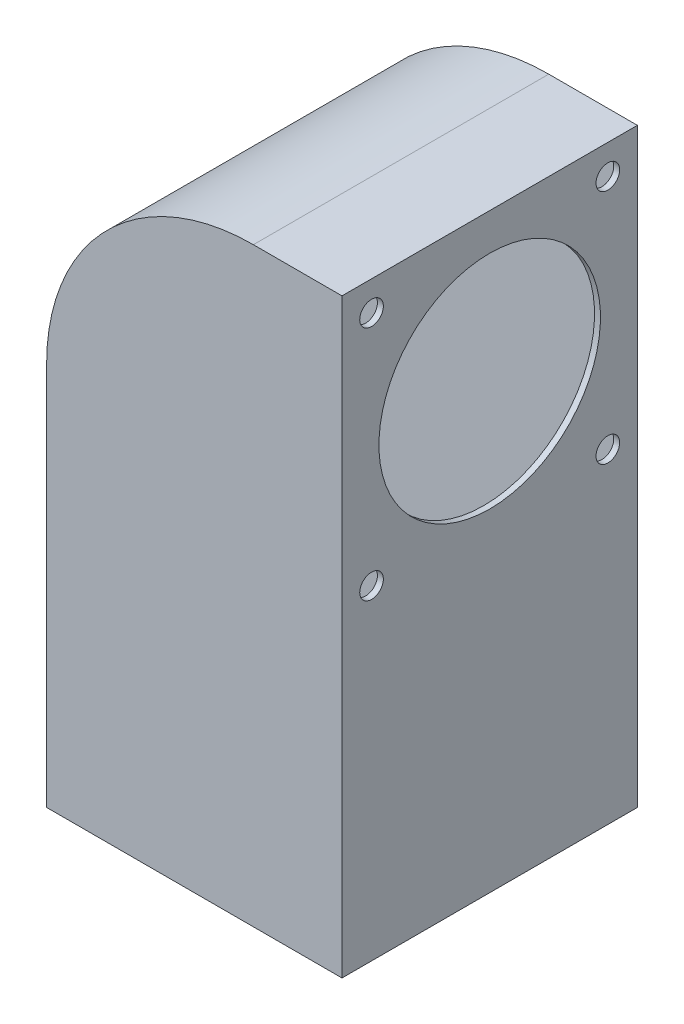
ISO-10303-21;
HEADER;
FILE_DESCRIPTION(('STEP AP214'),'2;1');
FILE_NAME('part.step','',(''),(''),'','','');
FILE_SCHEMA(('AUTOMOTIVE_DESIGN { 1 0 10303 214 1 1 1 1 }'));
ENDSEC;
DATA;
#1=APPLICATION_CONTEXT('core data for automotive mechanical design processes');
#2=APPLICATION_PROTOCOL_DEFINITION('international standard','automotive_design',2000,#1);
#3=PRODUCT_CONTEXT('',#1,'mechanical');
#4=PRODUCT('Part','Part','',(#3));
#5=PRODUCT_RELATED_PRODUCT_CATEGORY('part','',(#4));
#6=PRODUCT_DEFINITION_FORMATION('','',#4);
#7=PRODUCT_DEFINITION_CONTEXT('part definition',#1,'design');
#8=PRODUCT_DEFINITION('design','',#6,#7);
#9=PRODUCT_DEFINITION_SHAPE('','',#8);
#10=(LENGTH_UNIT() NAMED_UNIT(*) SI_UNIT(.MILLI.,.METRE.));
#11=(NAMED_UNIT(*) PLANE_ANGLE_UNIT() SI_UNIT($,.RADIAN.));
#12=(NAMED_UNIT(*) SI_UNIT($,.STERADIAN.) SOLID_ANGLE_UNIT());
#13=UNCERTAINTY_MEASURE_WITH_UNIT(LENGTH_MEASURE(1.E-05),#10,'distance_accuracy_value','');
#14=(GEOMETRIC_REPRESENTATION_CONTEXT(3) GLOBAL_UNCERTAINTY_ASSIGNED_CONTEXT((#13)) GLOBAL_UNIT_ASSIGNED_CONTEXT((#10,
#11,#12)) REPRESENTATION_CONTEXT('',''));
#15=CARTESIAN_POINT('',(0.,0.,0.));
#16=DIRECTION('',(0.,0.,1.));
#17=DIRECTION('',(1.,0.,0.));
#18=AXIS2_PLACEMENT_3D('',#15,#16,#17);
#19=CARTESIAN_POINT('',(0.,-200.,0.));
#20=DIRECTION('',(0.,-1.,0.));
#21=DIRECTION('',(-1.,0.,0.));
#22=AXIS2_PLACEMENT_3D('',#19,#20,#21);
#23=PLANE('',#22);
#24=DIRECTION('',(-1.,0.,0.));
#25=VECTOR('',#24,1.);
#26=CARTESIAN_POINT('',(0.,-200.,0.));
#27=LINE('',#26,#25);
#28=CARTESIAN_POINT('',(0.,-200.,0.));
#29=VERTEX_POINT('',#28);
#30=CARTESIAN_POINT('',(-100.,-200.,0.));
#31=VERTEX_POINT('',#30);
#32=EDGE_CURVE('E53',#29,#31,#27,.T.);
#33=ORIENTED_EDGE('',*,*,#32,.F.);
#34=DIRECTION('',(0.,0.,1.));
#35=VECTOR('',#34,1.);
#36=CARTESIAN_POINT('',(0.,-200.,0.));
#37=LINE('',#36,#35);
#38=CARTESIAN_POINT('',(0.,-200.,100.));
#39=VERTEX_POINT('',#38);
#40=EDGE_CURVE('E44',#29,#39,#37,.T.);
#41=ORIENTED_EDGE('',*,*,#40,.T.);
#42=DIRECTION('',(-1.,0.,0.));
#43=VECTOR('',#42,1.);
#44=CARTESIAN_POINT('',(-100.,-200.,100.));
#45=LINE('',#44,#43);
#46=CARTESIAN_POINT('',(-100.,-200.,100.));
#47=VERTEX_POINT('',#46);
#48=EDGE_CURVE('E195',#39,#47,#45,.T.);
#49=ORIENTED_EDGE('',*,*,#48,.T.);
#50=DIRECTION('',(0.,0.,1.));
#51=VECTOR('',#50,1.);
#52=CARTESIAN_POINT('',(-100.,-200.,0.));
#53=LINE('',#52,#51);
#54=EDGE_CURVE('E175',#31,#47,#53,.T.);
#55=ORIENTED_EDGE('',*,*,#54,.F.);
#56=EDGE_LOOP('',(#33,#41,#49,#55));
#57=FACE_BOUND('',#56,.T.);
#58=DIRECTION('',(-1.,0.,0.));
#59=VECTOR('',#58,1.);
#60=CARTESIAN_POINT('',(-30.,-200.,2.));
#61=LINE('',#60,#59);
#62=CARTESIAN_POINT('',(-1.99999999999997,-200.,2.));
#63=VERTEX_POINT('',#62);
#64=CARTESIAN_POINT('',(-98.,-200.,2.));
#65=VERTEX_POINT('',#64);
#66=EDGE_CURVE('E108',#63,#65,#61,.T.);
#67=ORIENTED_EDGE('',*,*,#66,.T.);
#68=DIRECTION('',(0.,0.,1.));
#69=VECTOR('',#68,1.);
#70=CARTESIAN_POINT('',(-98.,-200.,0.));
#71=LINE('',#70,#69);
#72=CARTESIAN_POINT('',(-97.9999999999999,-200.,98.));
#73=VERTEX_POINT('',#72);
#74=EDGE_CURVE('E115',#65,#73,#71,.T.);
#75=ORIENTED_EDGE('',*,*,#74,.T.);
#76=DIRECTION('',(-1.,0.,0.));
#77=VECTOR('',#76,1.);
#78=CARTESIAN_POINT('',(-30.,-200.,98.));
#79=LINE('',#78,#77);
#80=CARTESIAN_POINT('',(-1.99999999999998,-200.,98.));
#81=VERTEX_POINT('',#80);
#82=EDGE_CURVE('E128',#81,#73,#79,.T.);
#83=ORIENTED_EDGE('',*,*,#82,.F.);
#84=DIRECTION('',(0.,0.,1.));
#85=VECTOR('',#84,1.);
#86=CARTESIAN_POINT('',(-1.99999999999998,-200.,0.));
#87=LINE('',#86,#85);
#88=EDGE_CURVE('E127',#63,#81,#87,.T.);
#89=ORIENTED_EDGE('',*,*,#88,.F.);
#90=EDGE_LOOP('',(#67,#75,#83,#89));
#91=FACE_BOUND('',#90,.T.);
#92=ADVANCED_FACE('F35',(#57,#91),#23,.T.);
#93=CARTESIAN_POINT('',(0.,0.,0.));
#94=DIRECTION('',(1.,0.,0.));
#95=DIRECTION('',(0.,1.,0.));
#96=AXIS2_PLACEMENT_3D('',#93,#94,#95);
#97=PLANE('',#96);
#98=CARTESIAN_POINT('',(0.,-90.,90.));
#99=DIRECTION('',(1.,0.,0.));
#100=DIRECTION('',(0.,-1.,0.));
#101=AXIS2_PLACEMENT_3D('',#98,#99,#100);
#102=CIRCLE('',#101,4.00000000000003);
#103=CARTESIAN_POINT('',(0.,-94.0000000000001,90.));
#104=VERTEX_POINT('',#103);
#105=EDGE_CURVE('E156',#104,#104,#102,.T.);
#106=ORIENTED_EDGE('',*,*,#105,.F.);
#107=EDGE_LOOP('',(#106));
#108=FACE_BOUND('',#107,.T.);
#109=CARTESIAN_POINT('',(0.,-90.,9.99999999999999));
#110=DIRECTION('',(1.,0.,0.));
#111=DIRECTION('',(0.,1.,0.));
#112=AXIS2_PLACEMENT_3D('',#109,#110,#111);
#113=CIRCLE('',#112,3.99999999999995);
#114=CARTESIAN_POINT('',(0.,-86.0000000000001,9.99999999999999));
#115=VERTEX_POINT('',#114);
#116=EDGE_CURVE('E146',#115,#115,#113,.T.);
#117=ORIENTED_EDGE('',*,*,#116,.F.);
#118=EDGE_LOOP('',(#117));
#119=FACE_BOUND('',#118,.T.);
#120=CARTESIAN_POINT('',(0.,-10.,9.99999999999999));
#121=DIRECTION('',(1.,0.,0.));
#122=DIRECTION('',(0.,-1.,0.));
#123=AXIS2_PLACEMENT_3D('',#120,#121,#122);
#124=CIRCLE('',#123,3.99999999999998);
#125=CARTESIAN_POINT('',(0.,-14.,9.99999999999999));
#126=VERTEX_POINT('',#125);
#127=EDGE_CURVE('E143',#126,#126,#124,.T.);
#128=ORIENTED_EDGE('',*,*,#127,.F.);
#129=EDGE_LOOP('',(#128));
#130=FACE_BOUND('',#129,.T.);
#131=CARTESIAN_POINT('',(0.,-10.,90.));
#132=DIRECTION('',(1.,0.,0.));
#133=DIRECTION('',(0.,1.,0.));
#134=AXIS2_PLACEMENT_3D('',#131,#132,#133);
#135=CIRCLE('',#134,4.00000000000001);
#136=CARTESIAN_POINT('',(0.,-6.00000000000002,90.));
#137=VERTEX_POINT('',#136);
#138=EDGE_CURVE('E140',#137,#137,#135,.T.);
#139=ORIENTED_EDGE('',*,*,#138,.F.);
#140=EDGE_LOOP('',(#139));
#141=FACE_BOUND('',#140,.T.);
#142=CARTESIAN_POINT('',(0.,-50.,50.));
#143=DIRECTION('',(1.,0.,0.));
#144=DIRECTION('',(0.,1.,0.));
#145=AXIS2_PLACEMENT_3D('',#142,#143,#144);
#146=CIRCLE('',#145,37.5);
#147=CARTESIAN_POINT('',(0.,-12.5,50.));
#148=VERTEX_POINT('',#147);
#149=EDGE_CURVE('E136',#148,#148,#146,.T.);
#150=ORIENTED_EDGE('',*,*,#149,.F.);
#151=EDGE_LOOP('',(#150));
#152=FACE_BOUND('',#151,.T.);
#153=DIRECTION('',(0.,1.,0.));
#154=VECTOR('',#153,1.);
#155=CARTESIAN_POINT('',(0.,0.,100.));
#156=LINE('',#155,#154);
#157=CARTESIAN_POINT('',(0.,0.,100.));
#158=VERTEX_POINT('',#157);
#159=EDGE_CURVE('E166',#39,#158,#156,.T.);
#160=ORIENTED_EDGE('',*,*,#159,.F.);
#161=ORIENTED_EDGE('',*,*,#40,.F.);
#162=DIRECTION('',(0.,1.,0.));
#163=VECTOR('',#162,1.);
#164=CARTESIAN_POINT('',(0.,0.,0.));
#165=LINE('',#164,#163);
#166=CARTESIAN_POINT('',(0.,0.,0.));
#167=VERTEX_POINT('',#166);
#168=EDGE_CURVE('E11',#29,#167,#165,.T.);
#169=ORIENTED_EDGE('',*,*,#168,.T.);
#170=DIRECTION('',(0.,0.,1.));
#171=VECTOR('',#170,1.);
#172=CARTESIAN_POINT('',(0.,0.,0.));
#173=LINE('',#172,#171);
#174=EDGE_CURVE('E167',#167,#158,#173,.T.);
#175=ORIENTED_EDGE('',*,*,#174,.T.);
#176=EDGE_LOOP('',(#160,#161,#169,#175));
#177=FACE_BOUND('',#176,.T.);
#178=ADVANCED_FACE('F239',(#108,#119,#130,#141,#152,#177),#97,.T.);
#179=CARTESIAN_POINT('',(0.,0.,0.));
#180=DIRECTION('',(0.,1.,0.));
#181=DIRECTION('',(-1.,0.,0.));
#182=AXIS2_PLACEMENT_3D('',#179,#180,#181);
#183=PLANE('',#182);
#184=DIRECTION('',(-1.,0.,0.));
#185=VECTOR('',#184,1.);
#186=CARTESIAN_POINT('',(0.,0.,100.));
#187=LINE('',#186,#185);
#188=CARTESIAN_POINT('',(-30.,0.,100.));
#189=VERTEX_POINT('',#188);
#190=EDGE_CURVE('E171',#158,#189,#187,.T.);
#191=ORIENTED_EDGE('',*,*,#190,.F.);
#192=ORIENTED_EDGE('',*,*,#174,.F.);
#193=DIRECTION('',(-1.,0.,0.));
#194=VECTOR('',#193,1.);
#195=CARTESIAN_POINT('',(0.,0.,0.));
#196=LINE('',#195,#194);
#197=CARTESIAN_POINT('',(-30.,0.,0.));
#198=VERTEX_POINT('',#197);
#199=EDGE_CURVE('E163',#167,#198,#196,.T.);
#200=ORIENTED_EDGE('',*,*,#199,.T.);
#201=DIRECTION('',(0.,0.,1.));
#202=VECTOR('',#201,1.);
#203=CARTESIAN_POINT('',(-30.,0.,0.));
#204=LINE('',#203,#202);
#205=EDGE_CURVE('E172',#198,#189,#204,.T.);
#206=ORIENTED_EDGE('',*,*,#205,.T.);
#207=EDGE_LOOP('',(#191,#192,#200,#206));
#208=FACE_BOUND('',#207,.T.);
#209=ADVANCED_FACE('F241',(#208),#183,.T.);
#210=CARTESIAN_POINT('',(-30.,-70.,0.));
#211=DIRECTION('',(0.,0.,1.));
#212=DIRECTION('',(1.,0.,0.));
#213=AXIS2_PLACEMENT_3D('',#210,#211,#212);
#214=CYLINDRICAL_SURFACE('',#213,70.);
#215=CARTESIAN_POINT('',(-30.,-70.,100.));
#216=DIRECTION('',(0.,0.,1.));
#217=DIRECTION('',(1.,0.,0.));
#218=AXIS2_PLACEMENT_3D('',#215,#216,#217);
#219=CIRCLE('',#218,70.);
#220=CARTESIAN_POINT('',(-100.,-70.,100.));
#221=VERTEX_POINT('',#220);
#222=EDGE_CURVE('E179',#189,#221,#219,.T.);
#223=ORIENTED_EDGE('',*,*,#222,.F.);
#224=ORIENTED_EDGE('',*,*,#205,.F.);
#225=CARTESIAN_POINT('',(-30.,-70.,0.));
#226=DIRECTION('',(0.,0.,1.));
#227=DIRECTION('',(1.,0.,0.));
#228=AXIS2_PLACEMENT_3D('',#225,#226,#227);
#229=CIRCLE('',#228,70.);
#230=CARTESIAN_POINT('',(-100.,-70.,0.));
#231=VERTEX_POINT('',#230);
#232=EDGE_CURVE('E168',#198,#231,#229,.T.);
#233=ORIENTED_EDGE('',*,*,#232,.T.);
#234=DIRECTION('',(0.,0.,1.));
#235=VECTOR('',#234,1.);
#236=CARTESIAN_POINT('',(-100.,-70.,0.));
#237=LINE('',#236,#235);
#238=EDGE_CURVE('E176',#231,#221,#237,.T.);
#239=ORIENTED_EDGE('',*,*,#238,.T.);
#240=EDGE_LOOP('',(#223,#224,#233,#239));
#241=FACE_BOUND('',#240,.T.);
#242=ADVANCED_FACE('F248',(#241),#214,.T.);
#243=CARTESIAN_POINT('',(-100.,-70.,0.));
#244=DIRECTION('',(-1.,0.,0.));
#245=DIRECTION('',(0.,-1.,0.));
#246=AXIS2_PLACEMENT_3D('',#243,#244,#245);
#247=PLANE('',#246);
#248=DIRECTION('',(0.,-1.,0.));
#249=VECTOR('',#248,1.);
#250=CARTESIAN_POINT('',(-100.,-70.,100.));
#251=LINE('',#250,#249);
#252=EDGE_CURVE('E181',#221,#47,#251,.T.);
#253=ORIENTED_EDGE('',*,*,#252,.F.);
#254=ORIENTED_EDGE('',*,*,#238,.F.);
#255=DIRECTION('',(0.,-1.,0.));
#256=VECTOR('',#255,1.);
#257=CARTESIAN_POINT('',(-100.,-70.,0.));
#258=LINE('',#257,#256);
#259=EDGE_CURVE('E173',#231,#31,#258,.T.);
#260=ORIENTED_EDGE('',*,*,#259,.T.);
#261=ORIENTED_EDGE('',*,*,#54,.T.);
#262=EDGE_LOOP('',(#253,#254,#260,#261));
#263=FACE_BOUND('',#262,.T.);
#264=ADVANCED_FACE('F260',(#263),#247,.T.);
#265=CARTESIAN_POINT('',(-30.,-70.,0.));
#266=DIRECTION('',(0.,0.,-1.));
#267=DIRECTION('',(-1.,0.,0.));
#268=AXIS2_PLACEMENT_3D('',#265,#266,#267);
#269=PLANE('',#268);
#270=ORIENTED_EDGE('',*,*,#168,.F.);
#271=ORIENTED_EDGE('',*,*,#32,.T.);
#272=ORIENTED_EDGE('',*,*,#259,.F.);
#273=ORIENTED_EDGE('',*,*,#232,.F.);
#274=ORIENTED_EDGE('',*,*,#199,.F.);
#275=EDGE_LOOP('',(#270,#271,#272,#273,#274));
#276=FACE_BOUND('',#275,.T.);
#277=ADVANCED_FACE('F257',(#276),#269,.T.);
#278=CARTESIAN_POINT('',(-30.,-70.,100.));
#279=DIRECTION('',(0.,0.,-1.));
#280=DIRECTION('',(-1.,0.,0.));
#281=AXIS2_PLACEMENT_3D('',#278,#279,#280);
#282=PLANE('',#281);
#283=ORIENTED_EDGE('',*,*,#252,.T.);
#284=ORIENTED_EDGE('',*,*,#48,.F.);
#285=ORIENTED_EDGE('',*,*,#159,.T.);
#286=ORIENTED_EDGE('',*,*,#190,.T.);
#287=ORIENTED_EDGE('',*,*,#222,.T.);
#288=EDGE_LOOP('',(#283,#284,#285,#286,#287));
#289=FACE_BOUND('',#288,.T.);
#290=ADVANCED_FACE('F252',(#289),#282,.F.);
#291=CARTESIAN_POINT('',(-2.,0.,0.));
#292=DIRECTION('',(1.,0.,0.));
#293=DIRECTION('',(0.,1.,0.));
#294=AXIS2_PLACEMENT_3D('',#291,#292,#293);
#295=PLANE('',#294);
#296=CARTESIAN_POINT('',(-1.99999999999999,-90.,90.));
#297=DIRECTION('',(1.,0.,0.));
#298=DIRECTION('',(0.,1.,0.));
#299=AXIS2_PLACEMENT_3D('',#296,#297,#298);
#300=CIRCLE('',#299,4.00000000000003);
#301=CARTESIAN_POINT('',(-1.99999999999999,-86.,90.));
#302=VERTEX_POINT('',#301);
#303=EDGE_CURVE('E38',#302,#302,#300,.T.);
#304=ORIENTED_EDGE('',*,*,#303,.T.);
#305=EDGE_LOOP('',(#304));
#306=FACE_BOUND('',#305,.T.);
#307=CARTESIAN_POINT('',(-1.99999999999999,-90.,9.99999999999999));
#308=DIRECTION('',(1.,0.,0.));
#309=DIRECTION('',(0.,1.,0.));
#310=AXIS2_PLACEMENT_3D('',#307,#308,#309);
#311=CIRCLE('',#310,3.99999999999995);
#312=CARTESIAN_POINT('',(-1.99999999999999,-86.0000000000001,9.99999999999999));
#313=VERTEX_POINT('',#312);
#314=EDGE_CURVE('E144',#313,#313,#311,.T.);
#315=ORIENTED_EDGE('',*,*,#314,.T.);
#316=EDGE_LOOP('',(#315));
#317=FACE_BOUND('',#316,.T.);
#318=CARTESIAN_POINT('',(-2.,-10.,9.99999999999999));
#319=DIRECTION('',(1.,0.,0.));
#320=DIRECTION('',(0.,1.,0.));
#321=AXIS2_PLACEMENT_3D('',#318,#319,#320);
#322=CIRCLE('',#321,3.99999999999998);
#323=CARTESIAN_POINT('',(-2.,-6.00000000000004,9.99999999999999));
#324=VERTEX_POINT('',#323);
#325=EDGE_CURVE('E141',#324,#324,#322,.T.);
#326=ORIENTED_EDGE('',*,*,#325,.T.);
#327=EDGE_LOOP('',(#326));
#328=FACE_BOUND('',#327,.T.);
#329=CARTESIAN_POINT('',(-2.,-10.,90.));
#330=DIRECTION('',(1.,0.,0.));
#331=DIRECTION('',(0.,1.,0.));
#332=AXIS2_PLACEMENT_3D('',#329,#330,#331);
#333=CIRCLE('',#332,4.00000000000001);
#334=CARTESIAN_POINT('',(-2.,-6.00000000000002,90.));
#335=VERTEX_POINT('',#334);
#336=EDGE_CURVE('E137',#335,#335,#333,.T.);
#337=ORIENTED_EDGE('',*,*,#336,.T.);
#338=EDGE_LOOP('',(#337));
#339=FACE_BOUND('',#338,.T.);
#340=CARTESIAN_POINT('',(-1.99999999999999,-50.,50.));
#341=DIRECTION('',(1.,0.,0.));
#342=DIRECTION('',(0.,1.,0.));
#343=AXIS2_PLACEMENT_3D('',#340,#341,#342);
#344=CIRCLE('',#343,37.5);
#345=CARTESIAN_POINT('',(-2.,-12.5,50.));
#346=VERTEX_POINT('',#345);
#347=EDGE_CURVE('E131',#346,#346,#344,.T.);
#348=ORIENTED_EDGE('',*,*,#347,.T.);
#349=EDGE_LOOP('',(#348));
#350=FACE_BOUND('',#349,.T.);
#351=DIRECTION('',(0.,1.,0.));
#352=VECTOR('',#351,1.);
#353=CARTESIAN_POINT('',(-2.,0.,98.));
#354=LINE('',#353,#352);
#355=CARTESIAN_POINT('',(-2.,-2.,98.));
#356=VERTEX_POINT('',#355);
#357=EDGE_CURVE('E199',#81,#356,#354,.T.);
#358=ORIENTED_EDGE('',*,*,#357,.T.);
#359=DIRECTION('',(0.,0.,1.));
#360=VECTOR('',#359,1.);
#361=CARTESIAN_POINT('',(-2.,-2.,0.));
#362=LINE('',#361,#360);
#363=CARTESIAN_POINT('',(-2.,-2.,2.));
#364=VERTEX_POINT('',#363);
#365=EDGE_CURVE('E204',#364,#356,#362,.T.);
#366=ORIENTED_EDGE('',*,*,#365,.F.);
#367=DIRECTION('',(0.,1.,0.));
#368=VECTOR('',#367,1.);
#369=CARTESIAN_POINT('',(-2.,0.,2.));
#370=LINE('',#369,#368);
#371=EDGE_CURVE('E198',#63,#364,#370,.T.);
#372=ORIENTED_EDGE('',*,*,#371,.F.);
#373=ORIENTED_EDGE('',*,*,#88,.T.);
#374=EDGE_LOOP('',(#358,#366,#372,#373));
#375=FACE_BOUND('',#374,.T.);
#376=ADVANCED_FACE('F220',(#306,#317,#328,#339,#350,#375),#295,.F.);
#377=CARTESIAN_POINT('',(0.,-2.,0.));
#378=DIRECTION('',(0.,1.,0.));
#379=DIRECTION('',(-1.,0.,0.));
#380=AXIS2_PLACEMENT_3D('',#377,#378,#379);
#381=PLANE('',#380);
#382=DIRECTION('',(-1.,0.,0.));
#383=VECTOR('',#382,1.);
#384=CARTESIAN_POINT('',(0.,-2.,98.));
#385=LINE('',#384,#383);
#386=CARTESIAN_POINT('',(-30.,-2.,98.));
#387=VERTEX_POINT('',#386);
#388=EDGE_CURVE('E207',#356,#387,#385,.T.);
#389=ORIENTED_EDGE('',*,*,#388,.T.);
#390=DIRECTION('',(0.,0.,1.));
#391=VECTOR('',#390,1.);
#392=CARTESIAN_POINT('',(-30.,-2.,0.));
#393=LINE('',#392,#391);
#394=CARTESIAN_POINT('',(-30.,-2.,2.));
#395=VERTEX_POINT('',#394);
#396=EDGE_CURVE('E211',#395,#387,#393,.T.);
#397=ORIENTED_EDGE('',*,*,#396,.F.);
#398=DIRECTION('',(-1.,0.,0.));
#399=VECTOR('',#398,1.);
#400=CARTESIAN_POINT('',(0.,-2.,2.));
#401=LINE('',#400,#399);
#402=EDGE_CURVE('E202',#364,#395,#401,.T.);
#403=ORIENTED_EDGE('',*,*,#402,.F.);
#404=ORIENTED_EDGE('',*,*,#365,.T.);
#405=EDGE_LOOP('',(#389,#397,#403,#404));
#406=FACE_BOUND('',#405,.T.);
#407=ADVANCED_FACE('F224',(#406),#381,.F.);
#408=CARTESIAN_POINT('',(-30.,-70.,0.));
#409=DIRECTION('',(0.,0.,1.));
#410=DIRECTION('',(1.,0.,0.));
#411=AXIS2_PLACEMENT_3D('',#408,#409,#410);
#412=CYLINDRICAL_SURFACE('',#411,68.);
#413=CARTESIAN_POINT('',(-30.,-70.,98.));
#414=DIRECTION('',(0.,0.,-1.));
#415=DIRECTION('',(-1.,0.,0.));
#416=AXIS2_PLACEMENT_3D('',#413,#414,#415);
#417=CIRCLE('',#416,68.);
#418=CARTESIAN_POINT('',(-98.,-70.,98.));
#419=VERTEX_POINT('',#418);
#420=EDGE_CURVE('E124',#387,#419,#417,.F.);
#421=ORIENTED_EDGE('',*,*,#420,.T.);
#422=DIRECTION('',(0.,0.,1.));
#423=VECTOR('',#422,1.);
#424=CARTESIAN_POINT('',(-98.,-70.,0.));
#425=LINE('',#424,#423);
#426=CARTESIAN_POINT('',(-98.,-70.,2.));
#427=VERTEX_POINT('',#426);
#428=EDGE_CURVE('E116',#427,#419,#425,.T.);
#429=ORIENTED_EDGE('',*,*,#428,.F.);
#430=CARTESIAN_POINT('',(-30.,-70.,2.));
#431=DIRECTION('',(0.,0.,-1.));
#432=DIRECTION('',(-1.,0.,0.));
#433=AXIS2_PLACEMENT_3D('',#430,#431,#432);
#434=CIRCLE('',#433,68.);
#435=EDGE_CURVE('E111',#395,#427,#434,.F.);
#436=ORIENTED_EDGE('',*,*,#435,.F.);
#437=ORIENTED_EDGE('',*,*,#396,.T.);
#438=EDGE_LOOP('',(#421,#429,#436,#437));
#439=FACE_BOUND('',#438,.T.);
#440=ADVANCED_FACE('F226',(#439),#412,.F.);
#441=CARTESIAN_POINT('',(-98.,-70.,0.));
#442=DIRECTION('',(-1.,0.,0.));
#443=DIRECTION('',(0.,-1.,0.));
#444=AXIS2_PLACEMENT_3D('',#441,#442,#443);
#445=PLANE('',#444);
#446=DIRECTION('',(0.,-1.,0.));
#447=VECTOR('',#446,1.);
#448=CARTESIAN_POINT('',(-98.,-70.,98.));
#449=LINE('',#448,#447);
#450=EDGE_CURVE('E120',#419,#73,#449,.T.);
#451=ORIENTED_EDGE('',*,*,#450,.T.);
#452=ORIENTED_EDGE('',*,*,#74,.F.);
#453=DIRECTION('',(0.,-1.,0.));
#454=VECTOR('',#453,1.);
#455=CARTESIAN_POINT('',(-98.,-70.,2.));
#456=LINE('',#455,#454);
#457=EDGE_CURVE('E103',#427,#65,#456,.T.);
#458=ORIENTED_EDGE('',*,*,#457,.F.);
#459=ORIENTED_EDGE('',*,*,#428,.T.);
#460=EDGE_LOOP('',(#451,#452,#458,#459));
#461=FACE_BOUND('',#460,.T.);
#462=ADVANCED_FACE('F119',(#461),#445,.F.);
#463=CARTESIAN_POINT('',(-30.,-70.,2.));
#464=DIRECTION('',(0.,0.,-1.));
#465=DIRECTION('',(-1.,0.,0.));
#466=AXIS2_PLACEMENT_3D('',#463,#464,#465);
#467=PLANE('',#466);
#468=ORIENTED_EDGE('',*,*,#371,.T.);
#469=ORIENTED_EDGE('',*,*,#402,.T.);
#470=ORIENTED_EDGE('',*,*,#435,.T.);
#471=ORIENTED_EDGE('',*,*,#457,.T.);
#472=ORIENTED_EDGE('',*,*,#66,.F.);
#473=EDGE_LOOP('',(#468,#469,#470,#471,#472));
#474=FACE_BOUND('',#473,.T.);
#475=ADVANCED_FACE('F106',(#474),#467,.F.);
#476=CARTESIAN_POINT('',(-30.,-70.,98.));
#477=DIRECTION('',(0.,0.,-1.));
#478=DIRECTION('',(-1.,0.,0.));
#479=AXIS2_PLACEMENT_3D('',#476,#477,#478);
#480=PLANE('',#479);
#481=ORIENTED_EDGE('',*,*,#450,.F.);
#482=ORIENTED_EDGE('',*,*,#420,.F.);
#483=ORIENTED_EDGE('',*,*,#388,.F.);
#484=ORIENTED_EDGE('',*,*,#357,.F.);
#485=ORIENTED_EDGE('',*,*,#82,.T.);
#486=EDGE_LOOP('',(#481,#482,#483,#484,#485));
#487=FACE_BOUND('',#486,.T.);
#488=ADVANCED_FACE('F228',(#487),#480,.T.);
#489=CARTESIAN_POINT('',(-11.,-50.,50.));
#490=DIRECTION('',(1.,0.,0.));
#491=DIRECTION('',(0.,1.,0.));
#492=AXIS2_PLACEMENT_3D('',#489,#490,#491);
#493=CYLINDRICAL_SURFACE('',#492,37.5);
#494=ORIENTED_EDGE('',*,*,#149,.T.);
#495=EDGE_LOOP('',(#494));
#496=FACE_BOUND('',#495,.T.);
#497=ORIENTED_EDGE('',*,*,#347,.F.);
#498=EDGE_LOOP('',(#497));
#499=FACE_BOUND('',#498,.T.);
#500=ADVANCED_FACE('F230',(#496,#499),#493,.F.);
#501=CARTESIAN_POINT('',(-11.,-10.,90.));
#502=DIRECTION('',(1.,0.,0.));
#503=DIRECTION('',(0.,1.,0.));
#504=AXIS2_PLACEMENT_3D('',#501,#502,#503);
#505=CYLINDRICAL_SURFACE('',#504,4.00000000000001);
#506=ORIENTED_EDGE('',*,*,#138,.T.);
#507=EDGE_LOOP('',(#506));
#508=FACE_BOUND('',#507,.T.);
#509=ORIENTED_EDGE('',*,*,#336,.F.);
#510=EDGE_LOOP('',(#509));
#511=FACE_BOUND('',#510,.T.);
#512=ADVANCED_FACE('F235',(#508,#511),#505,.F.);
#513=CARTESIAN_POINT('',(-11.,-10.,9.99999999999999));
#514=DIRECTION('',(1.,0.,0.));
#515=DIRECTION('',(0.,1.,0.));
#516=AXIS2_PLACEMENT_3D('',#513,#514,#515);
#517=CYLINDRICAL_SURFACE('',#516,3.99999999999998);
#518=ORIENTED_EDGE('',*,*,#127,.T.);
#519=EDGE_LOOP('',(#518));
#520=FACE_BOUND('',#519,.T.);
#521=ORIENTED_EDGE('',*,*,#325,.F.);
#522=EDGE_LOOP('',(#521));
#523=FACE_BOUND('',#522,.T.);
#524=ADVANCED_FACE('F317',(#520,#523),#517,.F.);
#525=CARTESIAN_POINT('',(-11.,-90.,9.99999999999999));
#526=DIRECTION('',(1.,0.,0.));
#527=DIRECTION('',(0.,1.,0.));
#528=AXIS2_PLACEMENT_3D('',#525,#526,#527);
#529=CYLINDRICAL_SURFACE('',#528,3.99999999999995);
#530=ORIENTED_EDGE('',*,*,#116,.T.);
#531=EDGE_LOOP('',(#530));
#532=FACE_BOUND('',#531,.T.);
#533=ORIENTED_EDGE('',*,*,#314,.F.);
#534=EDGE_LOOP('',(#533));
#535=FACE_BOUND('',#534,.T.);
#536=ADVANCED_FACE('F327',(#532,#535),#529,.F.);
#537=CARTESIAN_POINT('',(-11.,-90.,90.));
#538=DIRECTION('',(1.,0.,0.));
#539=DIRECTION('',(0.,1.,0.));
#540=AXIS2_PLACEMENT_3D('',#537,#538,#539);
#541=CYLINDRICAL_SURFACE('',#540,4.00000000000003);
#542=ORIENTED_EDGE('',*,*,#105,.T.);
#543=EDGE_LOOP('',(#542));
#544=FACE_BOUND('',#543,.T.);
#545=ORIENTED_EDGE('',*,*,#303,.F.);
#546=EDGE_LOOP('',(#545));
#547=FACE_BOUND('',#546,.T.);
#548=ADVANCED_FACE('F337',(#544,#547),#541,.F.);
#549=CLOSED_SHELL('',(#92,#178,#209,#242,#264,#277,#290,#376,#407,#440,#462,#475,#488,#500,#512,
#524,#536,#548));
#550=MANIFOLD_SOLID_BREP('B2',#549);
#551=ADVANCED_BREP_SHAPE_REPRESENTATION('',(#18,#550),#14);
#552=SHAPE_DEFINITION_REPRESENTATION(#9,#551);
ENDSEC;
END-ISO-10303-21;
